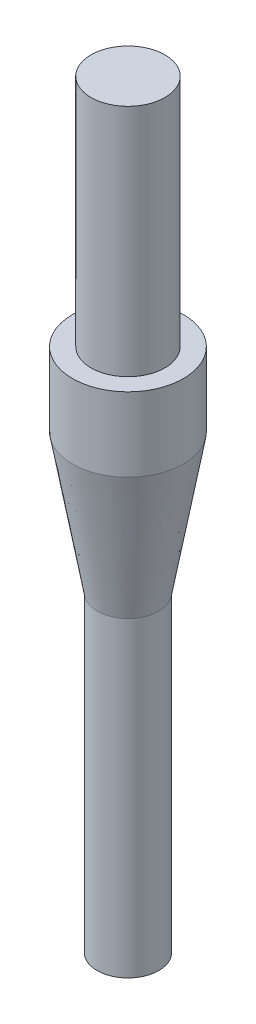
ISO-10303-21;
HEADER;
FILE_DESCRIPTION(('STEP AP214'),'2;1');
FILE_NAME('part.step','',(''),(''),'','','');
FILE_SCHEMA(('AUTOMOTIVE_DESIGN { 1 0 10303 214 1 1 1 1 }'));
ENDSEC;
DATA;
#1=APPLICATION_CONTEXT('core data for automotive mechanical design processes');
#2=APPLICATION_PROTOCOL_DEFINITION('international standard','automotive_design',2000,#1);
#3=PRODUCT_CONTEXT('',#1,'mechanical');
#4=PRODUCT('Part','Part','',(#3));
#5=PRODUCT_RELATED_PRODUCT_CATEGORY('part','',(#4));
#6=PRODUCT_DEFINITION_FORMATION('','',#4);
#7=PRODUCT_DEFINITION_CONTEXT('part definition',#1,'design');
#8=PRODUCT_DEFINITION('design','',#6,#7);
#9=PRODUCT_DEFINITION_SHAPE('','',#8);
#10=(LENGTH_UNIT() NAMED_UNIT(*) SI_UNIT(.MILLI.,.METRE.));
#11=(NAMED_UNIT(*) PLANE_ANGLE_UNIT() SI_UNIT($,.RADIAN.));
#12=(NAMED_UNIT(*) SI_UNIT($,.STERADIAN.) SOLID_ANGLE_UNIT());
#13=UNCERTAINTY_MEASURE_WITH_UNIT(LENGTH_MEASURE(1.E-05),#10,'distance_accuracy_value','');
#14=(GEOMETRIC_REPRESENTATION_CONTEXT(3) GLOBAL_UNCERTAINTY_ASSIGNED_CONTEXT((#13)) GLOBAL_UNIT_ASSIGNED_CONTEXT((#10,
#11,#12)) REPRESENTATION_CONTEXT('',''));
#15=CARTESIAN_POINT('',(0.,0.,0.));
#16=DIRECTION('',(0.,0.,1.));
#17=DIRECTION('',(1.,0.,0.));
#18=AXIS2_PLACEMENT_3D('',#15,#16,#17);
#19=CARTESIAN_POINT('',(17.59991122,47.,-5.79999466));
#20=DIRECTION('',(0.,1.,0.));
#21=DIRECTION('',(-1.,0.,0.));
#22=AXIS2_PLACEMENT_3D('',#19,#20,#21);
#23=PLANE('',#22);
#24=CARTESIAN_POINT('',(17.59991122,47.,-5.79999466));
#25=DIRECTION('',(0.,1.,0.));
#26=DIRECTION('',(-1.,0.,0.));
#27=AXIS2_PLACEMENT_3D('',#24,#25,#26);
#28=CIRCLE('',#27,1.5);
#29=CARTESIAN_POINT('',(16.09991122,47.,-5.79999466));
#30=VERTEX_POINT('',#29);
#31=EDGE_CURVE('E10',#30,#30,#28,.T.);
#32=ORIENTED_EDGE('',*,*,#31,.T.);
#33=EDGE_LOOP('',(#32));
#34=FACE_BOUND('',#33,.T.);
#35=ADVANCED_FACE('F33',(#34),#23,.T.);
#36=CARTESIAN_POINT('',(17.59991122,47.,-5.79999466));
#37=DIRECTION('',(0.,1.,0.));
#38=DIRECTION('',(-1.,0.,0.));
#39=AXIS2_PLACEMENT_3D('',#36,#37,#38);
#40=CYLINDRICAL_SURFACE('',#39,1.5);
#41=CARTESIAN_POINT('',(17.59991122,37.5,-5.79999466));
#42=DIRECTION('',(0.,1.,0.));
#43=DIRECTION('',(-1.,0.,0.));
#44=AXIS2_PLACEMENT_3D('',#41,#42,#43);
#45=CIRCLE('',#44,1.5);
#46=CARTESIAN_POINT('',(16.09991122,37.5,-5.79999466));
#47=VERTEX_POINT('',#46);
#48=EDGE_CURVE('E39',#47,#47,#45,.T.);
#49=ORIENTED_EDGE('',*,*,#48,.T.);
#50=EDGE_LOOP('',(#49));
#51=FACE_BOUND('',#50,.T.);
#52=ORIENTED_EDGE('',*,*,#31,.F.);
#53=EDGE_LOOP('',(#52));
#54=FACE_BOUND('',#53,.T.);
#55=ADVANCED_FACE('F71',(#51,#54),#40,.T.);
#56=CARTESIAN_POINT('',(19.09991122,37.5,-5.79999466));
#57=DIRECTION('',(0.,1.,0.));
#58=DIRECTION('',(-1.,0.,0.));
#59=AXIS2_PLACEMENT_3D('',#56,#57,#58);
#60=PLANE('',#59);
#61=CARTESIAN_POINT('',(17.59991122,37.5,-5.79999466));
#62=DIRECTION('',(0.,1.,0.));
#63=DIRECTION('',(-1.,0.,0.));
#64=AXIS2_PLACEMENT_3D('',#61,#62,#63);
#65=CIRCLE('',#64,2.25);
#66=CARTESIAN_POINT('',(15.3499112200001,37.5,-5.79999466));
#67=VERTEX_POINT('',#66);
#68=EDGE_CURVE('E43',#67,#67,#65,.T.);
#69=ORIENTED_EDGE('',*,*,#68,.T.);
#70=EDGE_LOOP('',(#69));
#71=FACE_BOUND('',#70,.T.);
#72=ORIENTED_EDGE('',*,*,#48,.F.);
#73=EDGE_LOOP('',(#72));
#74=FACE_BOUND('',#73,.T.);
#75=ADVANCED_FACE('F75',(#71,#74),#60,.T.);
#76=CARTESIAN_POINT('',(17.59991122,47.,-5.79999466));
#77=DIRECTION('',(0.,1.,0.));
#78=DIRECTION('',(-1.,0.,0.));
#79=AXIS2_PLACEMENT_3D('',#76,#77,#78);
#80=CYLINDRICAL_SURFACE('',#79,2.25);
#81=CARTESIAN_POINT('',(17.59991122,34.5,-5.79999466));
#82=DIRECTION('',(0.,1.,0.));
#83=DIRECTION('',(-1.,0.,0.));
#84=AXIS2_PLACEMENT_3D('',#81,#82,#83);
#85=CIRCLE('',#84,2.25);
#86=CARTESIAN_POINT('',(15.34991122,34.5,-5.79999466));
#87=VERTEX_POINT('',#86);
#88=EDGE_CURVE('E47',#87,#87,#85,.T.);
#89=ORIENTED_EDGE('',*,*,#88,.T.);
#90=EDGE_LOOP('',(#89));
#91=FACE_BOUND('',#90,.T.);
#92=ORIENTED_EDGE('',*,*,#68,.F.);
#93=EDGE_LOOP('',(#92));
#94=FACE_BOUND('',#93,.T.);
#95=ADVANCED_FACE('F79',(#91,#94),#80,.T.);
#96=CARTESIAN_POINT('',(17.59991122,34.5,-5.79999466));
#97=DIRECTION('',(0.,1.,0.));
#98=DIRECTION('',(-1.,0.,0.));
#99=AXIS2_PLACEMENT_3D('',#96,#97,#98);
#100=CONICAL_SURFACE('',#99,2.25,0.174532925199433);
#101=CARTESIAN_POINT('',(17.59991122,28.8287181803823,-5.79999466));
#102=DIRECTION('',(0.,1.,0.));
#103=DIRECTION('',(-1.,0.,0.));
#104=AXIS2_PLACEMENT_3D('',#101,#102,#103);
#105=CIRCLE('',#104,1.25);
#106=CARTESIAN_POINT('',(16.34991122,28.8287181803823,-5.79999466));
#107=VERTEX_POINT('',#106);
#108=EDGE_CURVE('E52',#107,#107,#105,.T.);
#109=ORIENTED_EDGE('',*,*,#108,.T.);
#110=EDGE_LOOP('',(#109));
#111=FACE_BOUND('',#110,.T.);
#112=ORIENTED_EDGE('',*,*,#88,.F.);
#113=EDGE_LOOP('',(#112));
#114=FACE_BOUND('',#113,.T.);
#115=ADVANCED_FACE('F68',(#111,#114),#100,.T.);
#116=CARTESIAN_POINT('',(17.59991122,47.,-5.79999466));
#117=DIRECTION('',(0.,1.,0.));
#118=DIRECTION('',(-1.,0.,0.));
#119=AXIS2_PLACEMENT_3D('',#116,#117,#118);
#120=CYLINDRICAL_SURFACE('',#119,1.25);
#121=CARTESIAN_POINT('',(17.59991122,16.20115928,-5.79999466));
#122=DIRECTION('',(0.,1.,0.));
#123=DIRECTION('',(-1.,0.,0.));
#124=AXIS2_PLACEMENT_3D('',#121,#122,#123);
#125=CIRCLE('',#124,1.25);
#126=CARTESIAN_POINT('',(16.34991122,16.20115928,-5.79999466));
#127=VERTEX_POINT('',#126);
#128=EDGE_CURVE('E55',#127,#127,#125,.T.);
#129=ORIENTED_EDGE('',*,*,#128,.T.);
#130=EDGE_LOOP('',(#129));
#131=FACE_BOUND('',#130,.T.);
#132=ORIENTED_EDGE('',*,*,#108,.F.);
#133=EDGE_LOOP('',(#132));
#134=FACE_BOUND('',#133,.T.);
#135=ADVANCED_FACE('F59',(#131,#134),#120,.T.);
#136=CARTESIAN_POINT('',(18.84991122,16.20115928,-5.79999466));
#137=DIRECTION('',(0.,-1.,0.));
#138=DIRECTION('',(1.,0.,0.));
#139=AXIS2_PLACEMENT_3D('',#136,#137,#138);
#140=PLANE('',#139);
#141=ORIENTED_EDGE('',*,*,#128,.F.);
#142=EDGE_LOOP('',(#141));
#143=FACE_BOUND('',#142,.T.);
#144=ADVANCED_FACE('F62',(#143),#140,.T.);
#145=CLOSED_SHELL('',(#35,#55,#75,#95,#115,#135,#144));
#146=MANIFOLD_SOLID_BREP('B2',#145);
#147=ADVANCED_BREP_SHAPE_REPRESENTATION('',(#18,#146),#14);
#148=SHAPE_DEFINITION_REPRESENTATION(#9,#147);
ENDSEC;
END-ISO-10303-21;
